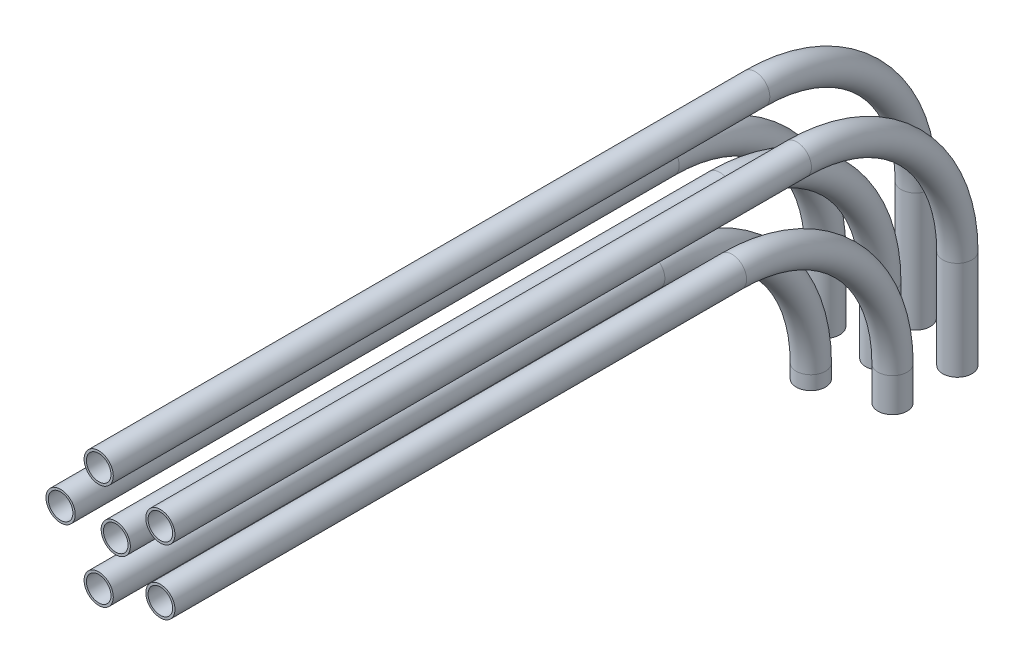
ISO-10303-21;
HEADER;
FILE_DESCRIPTION(('STEP AP214'),'2;1');
FILE_NAME('part.step','',(''),(''),'','','');
FILE_SCHEMA(('AUTOMOTIVE_DESIGN { 1 0 10303 214 1 1 1 1 }'));
ENDSEC;
DATA;
#1=APPLICATION_CONTEXT('core data for automotive mechanical design processes');
#2=APPLICATION_PROTOCOL_DEFINITION('international standard','automotive_design',2000,#1);
#3=PRODUCT_CONTEXT('',#1,'mechanical');
#4=PRODUCT('Part','Part','',(#3));
#5=PRODUCT_RELATED_PRODUCT_CATEGORY('part','',(#4));
#6=PRODUCT_DEFINITION_FORMATION('','',#4);
#7=PRODUCT_DEFINITION_CONTEXT('part definition',#1,'design');
#8=PRODUCT_DEFINITION('design','',#6,#7);
#9=PRODUCT_DEFINITION_SHAPE('','',#8);
#10=(LENGTH_UNIT() NAMED_UNIT(*) SI_UNIT(.MILLI.,.METRE.));
#11=(NAMED_UNIT(*) PLANE_ANGLE_UNIT() SI_UNIT($,.RADIAN.));
#12=(NAMED_UNIT(*) SI_UNIT($,.STERADIAN.) SOLID_ANGLE_UNIT());
#13=UNCERTAINTY_MEASURE_WITH_UNIT(LENGTH_MEASURE(1.E-05),#10,'distance_accuracy_value','');
#14=(GEOMETRIC_REPRESENTATION_CONTEXT(3) GLOBAL_UNCERTAINTY_ASSIGNED_CONTEXT((#13)) GLOBAL_UNIT_ASSIGNED_CONTEXT((#10,
#11,#12)) REPRESENTATION_CONTEXT('',''));
#15=CARTESIAN_POINT('',(0.,0.,0.));
#16=DIRECTION('',(0.,0.,1.));
#17=DIRECTION('',(1.,0.,0.));
#18=AXIS2_PLACEMENT_3D('',#15,#16,#17);
#19=CARTESIAN_POINT('',(-3.70820393249937,-11.4126781955418,120.));
#20=DIRECTION('',(0.,0.,1.));
#21=DIRECTION('',(1.,0.,0.));
#22=AXIS2_PLACEMENT_3D('',#19,#20,#21);
#23=PLANE('',#22);
#24=CARTESIAN_POINT('',(-3.70820393249937,-11.4126781955418,120.));
#25=DIRECTION('',(0.,0.,1.));
#26=DIRECTION('',(1.,0.,0.));
#27=AXIS2_PLACEMENT_3D('',#24,#25,#26);
#28=CIRCLE('',#27,3.175);
#29=CARTESIAN_POINT('',(-0.533203932499367,-11.4126781955418,120.));
#30=VERTEX_POINT('',#29);
#31=EDGE_CURVE('E12',#30,#30,#28,.T.);
#32=ORIENTED_EDGE('',*,*,#31,.T.);
#33=EDGE_LOOP('',(#32));
#34=FACE_BOUND('',#33,.T.);
#35=CARTESIAN_POINT('',(-3.70820393249937,-11.4126781955418,120.));
#36=DIRECTION('',(0.,0.,1.));
#37=DIRECTION('',(1.,0.,0.));
#38=AXIS2_PLACEMENT_3D('',#35,#36,#37);
#39=CIRCLE('',#38,2.675);
#40=CARTESIAN_POINT('',(-1.03320393249937,-11.4126781955418,120.));
#41=VERTEX_POINT('',#40);
#42=EDGE_CURVE('E82',#41,#41,#39,.T.);
#43=ORIENTED_EDGE('',*,*,#42,.F.);
#44=EDGE_LOOP('',(#43));
#45=FACE_BOUND('',#44,.T.);
#46=ADVANCED_FACE('F75',(#34,#45),#23,.T.);
#47=CARTESIAN_POINT('',(-3.70820393249937,-11.4126781955418,120.));
#48=DIRECTION('',(0.,0.,-1.));
#49=DIRECTION('',(-1.,0.,0.));
#50=AXIS2_PLACEMENT_3D('',#47,#48,#49);
#51=CYLINDRICAL_SURFACE('',#50,3.175);
#52=ORIENTED_EDGE('',*,*,#31,.F.);
#53=EDGE_LOOP('',(#52));
#54=FACE_BOUND('',#53,.T.);
#55=CARTESIAN_POINT('',(-3.70820393249937,-11.4126781955418,0.));
#56=DIRECTION('',(0.,0.,-1.));
#57=DIRECTION('',(-1.,0.,0.));
#58=AXIS2_PLACEMENT_3D('',#55,#56,#57);
#59=CIRCLE('',#58,3.175);
#60=CARTESIAN_POINT('',(-3.70820393249937,-8.23767819554184,0.));
#61=VERTEX_POINT('',#60);
#62=EDGE_CURVE('E95',#61,#61,#59,.T.);
#63=ORIENTED_EDGE('',*,*,#62,.F.);
#64=EDGE_LOOP('',(#63));
#65=FACE_BOUND('',#64,.T.);
#66=ADVANCED_FACE('F77',(#54,#65),#51,.T.);
#67=CARTESIAN_POINT('',(-3.70820393249937,-11.4126781955418,120.));
#68=DIRECTION('',(0.,0.,-1.));
#69=DIRECTION('',(-1.,0.,0.));
#70=AXIS2_PLACEMENT_3D('',#67,#68,#69);
#71=CYLINDRICAL_SURFACE('',#70,2.675);
#72=ORIENTED_EDGE('',*,*,#42,.T.);
#73=EDGE_LOOP('',(#72));
#74=FACE_BOUND('',#73,.T.);
#75=CARTESIAN_POINT('',(-3.70820393249937,-11.4126781955418,0.));
#76=DIRECTION('',(0.,0.,1.));
#77=DIRECTION('',(1.,0.,0.));
#78=AXIS2_PLACEMENT_3D('',#75,#76,#77);
#79=CIRCLE('',#78,2.675);
#80=CARTESIAN_POINT('',(-3.70820393249937,-8.73767819554184,0.));
#81=VERTEX_POINT('',#80);
#82=EDGE_CURVE('E86',#81,#81,#79,.T.);
#83=ORIENTED_EDGE('',*,*,#82,.F.);
#84=EDGE_LOOP('',(#83));
#85=FACE_BOUND('',#84,.T.);
#86=ADVANCED_FACE('F131',(#74,#85),#71,.F.);
#87=CARTESIAN_POINT('',(-3.70820393249937,-46.3376781955418,0.));
#88=DIRECTION('',(1.,0.,0.));
#89=DIRECTION('',(0.,0.,-1.));
#90=AXIS2_PLACEMENT_3D('',#87,#88,#89);
#91=TOROIDAL_SURFACE('',#90,34.925,2.675);
#92=CARTESIAN_POINT('',(-3.70820393249937,-46.337678195542,-34.925));
#93=DIRECTION('',(0.,-1.,0.));
#94=DIRECTION('',(0.,0.,-1.));
#95=AXIS2_PLACEMENT_3D('',#92,#93,#94);
#96=CIRCLE('',#95,2.675);
#97=CARTESIAN_POINT('',(-3.70820393249937,-46.337678195542,-37.6));
#98=VERTEX_POINT('',#97);
#99=EDGE_CURVE('E102',#98,#98,#96,.T.);
#100=CARTESIAN_POINT('',(-3.70820393249937,-46.3376781955418,0.));
#101=DIRECTION('',(1.,0.,0.));
#102=DIRECTION('',(0.,0.,-1.));
#103=AXIS2_PLACEMENT_3D('',#100,#101,#102);
#104=CIRCLE('',#103,37.6);
#105=EDGE_CURVE('',#98,#81,#104,.T.);
#106=ORIENTED_EDGE('',*,*,#99,.T.);
#107=ORIENTED_EDGE('',*,*,#82,.T.);
#108=ORIENTED_EDGE('',*,*,#105,.T.);
#109=ORIENTED_EDGE('',*,*,#105,.F.);
#110=EDGE_LOOP('',(#106,#108,#107,#109));
#111=FACE_BOUND('',#110,.T.);
#112=ADVANCED_FACE('F123',(#111),#91,.F.);
#113=CARTESIAN_POINT('',(-3.70820393249937,-46.3376781955418,0.));
#114=DIRECTION('',(1.,0.,0.));
#115=DIRECTION('',(0.,0.,-1.));
#116=AXIS2_PLACEMENT_3D('',#113,#114,#115);
#117=TOROIDAL_SURFACE('',#116,34.925,3.175);
#118=CARTESIAN_POINT('',(-3.70820393249937,-46.337678195542,-34.925));
#119=DIRECTION('',(0.,-1.,0.));
#120=DIRECTION('',(-1.,0.,0.));
#121=AXIS2_PLACEMENT_3D('',#118,#119,#120);
#122=CIRCLE('',#121,3.175);
#123=CARTESIAN_POINT('',(-3.70820393249937,-46.337678195542,-38.1));
#124=VERTEX_POINT('',#123);
#125=EDGE_CURVE('E91',#124,#124,#122,.T.);
#126=CARTESIAN_POINT('',(-3.70820393249937,-46.3376781955418,0.));
#127=DIRECTION('',(1.,0.,0.));
#128=DIRECTION('',(0.,0.,-1.));
#129=AXIS2_PLACEMENT_3D('',#126,#127,#128);
#130=CIRCLE('',#129,38.1);
#131=EDGE_CURVE('',#124,#61,#130,.T.);
#132=ORIENTED_EDGE('',*,*,#125,.F.);
#133=ORIENTED_EDGE('',*,*,#62,.T.);
#134=ORIENTED_EDGE('',*,*,#131,.T.);
#135=ORIENTED_EDGE('',*,*,#131,.F.);
#136=EDGE_LOOP('',(#132,#134,#133,#135));
#137=FACE_BOUND('',#136,.T.);
#138=ADVANCED_FACE('F114',(#137),#117,.T.);
#139=CARTESIAN_POINT('',(-3.70820393249937,-49.337678195542,-34.925));
#140=DIRECTION('',(0.,-1.,0.));
#141=DIRECTION('',(0.,0.,-1.));
#142=AXIS2_PLACEMENT_3D('',#139,#140,#141);
#143=PLANE('',#142);
#144=CARTESIAN_POINT('',(-3.70820393249937,-49.337678195542,-34.925));
#145=DIRECTION('',(0.,-1.,0.));
#146=DIRECTION('',(0.,0.,-1.));
#147=AXIS2_PLACEMENT_3D('',#144,#145,#146);
#148=CIRCLE('',#147,3.175);
#149=CARTESIAN_POINT('',(-3.70820393249937,-49.337678195542,-38.1));
#150=VERTEX_POINT('',#149);
#151=EDGE_CURVE('E98',#150,#150,#148,.T.);
#152=ORIENTED_EDGE('',*,*,#151,.T.);
#153=EDGE_LOOP('',(#152));
#154=FACE_BOUND('',#153,.T.);
#155=CARTESIAN_POINT('',(-3.70820393249937,-49.337678195542,-34.925));
#156=DIRECTION('',(0.,-1.,0.));
#157=DIRECTION('',(0.,0.,-1.));
#158=AXIS2_PLACEMENT_3D('',#155,#156,#157);
#159=CIRCLE('',#158,2.675);
#160=CARTESIAN_POINT('',(-3.70820393249937,-49.337678195542,-37.6));
#161=VERTEX_POINT('',#160);
#162=EDGE_CURVE('E101',#161,#161,#159,.T.);
#163=ORIENTED_EDGE('',*,*,#162,.F.);
#164=EDGE_LOOP('',(#163));
#165=FACE_BOUND('',#164,.T.);
#166=ADVANCED_FACE('F111',(#154,#165),#143,.T.);
#167=CARTESIAN_POINT('',(-3.70820393249937,-49.337678195542,-34.925));
#168=DIRECTION('',(0.,1.,0.));
#169=DIRECTION('',(0.,0.,1.));
#170=AXIS2_PLACEMENT_3D('',#167,#168,#169);
#171=CYLINDRICAL_SURFACE('',#170,3.175);
#172=ORIENTED_EDGE('',*,*,#151,.F.);
#173=EDGE_LOOP('',(#172));
#174=FACE_BOUND('',#173,.T.);
#175=ORIENTED_EDGE('',*,*,#125,.T.);
#176=EDGE_LOOP('',(#175));
#177=FACE_BOUND('',#176,.T.);
#178=ADVANCED_FACE('F113',(#174,#177),#171,.T.);
#179=CARTESIAN_POINT('',(-3.70820393249937,-49.337678195542,-34.925));
#180=DIRECTION('',(0.,1.,0.));
#181=DIRECTION('',(0.,0.,1.));
#182=AXIS2_PLACEMENT_3D('',#179,#180,#181);
#183=CYLINDRICAL_SURFACE('',#182,2.675);
#184=ORIENTED_EDGE('',*,*,#162,.T.);
#185=EDGE_LOOP('',(#184));
#186=FACE_BOUND('',#185,.T.);
#187=ORIENTED_EDGE('',*,*,#99,.F.);
#188=EDGE_LOOP('',(#187));
#189=FACE_BOUND('',#188,.T.);
#190=ADVANCED_FACE('F108',(#186,#189),#183,.F.);
#191=CLOSED_SHELL('',(#46,#66,#86,#112,#138,#166,#178,#190));
#192=MANIFOLD_SOLID_BREP('B2',#191);
#193=CARTESIAN_POINT('',(9.70820393249937,-7.05342302750968,120.));
#194=DIRECTION('',(0.,0.,1.));
#195=DIRECTION('',(1.,0.,0.));
#196=AXIS2_PLACEMENT_3D('',#193,#194,#195);
#197=PLANE('',#196);
#198=CARTESIAN_POINT('',(9.70820393249937,-7.05342302750968,120.));
#199=DIRECTION('',(0.,0.,1.));
#200=DIRECTION('',(1.,0.,0.));
#201=AXIS2_PLACEMENT_3D('',#198,#199,#200);
#202=CIRCLE('',#201,3.175);
#203=CARTESIAN_POINT('',(12.8832039324994,-7.05342302750968,120.));
#204=VERTEX_POINT('',#203);
#205=EDGE_CURVE('E74',#204,#204,#202,.T.);
#206=ORIENTED_EDGE('',*,*,#205,.T.);
#207=EDGE_LOOP('',(#206));
#208=FACE_BOUND('',#207,.T.);
#209=CARTESIAN_POINT('',(9.70820393249937,-7.05342302750968,120.));
#210=DIRECTION('',(0.,0.,1.));
#211=DIRECTION('',(1.,0.,0.));
#212=AXIS2_PLACEMENT_3D('',#209,#210,#211);
#213=CIRCLE('',#212,2.675);
#214=CARTESIAN_POINT('',(12.3832039324994,-7.05342302750968,120.));
#215=VERTEX_POINT('',#214);
#216=EDGE_CURVE('E211',#215,#215,#213,.T.);
#217=ORIENTED_EDGE('',*,*,#216,.F.);
#218=EDGE_LOOP('',(#217));
#219=FACE_BOUND('',#218,.T.);
#220=ADVANCED_FACE('F204',(#208,#219),#197,.T.);
#221=CARTESIAN_POINT('',(9.70820393249937,-7.05342302750968,120.));
#222=DIRECTION('',(0.,0.,-1.));
#223=DIRECTION('',(-1.,0.,0.));
#224=AXIS2_PLACEMENT_3D('',#221,#222,#223);
#225=CYLINDRICAL_SURFACE('',#224,3.175);
#226=ORIENTED_EDGE('',*,*,#205,.F.);
#227=EDGE_LOOP('',(#226));
#228=FACE_BOUND('',#227,.T.);
#229=CARTESIAN_POINT('',(9.70820393249937,-7.05342302750968,-4.35925517));
#230=DIRECTION('',(0.,0.,-1.));
#231=DIRECTION('',(-1.,0.,0.));
#232=AXIS2_PLACEMENT_3D('',#229,#230,#231);
#233=CIRCLE('',#232,3.175);
#234=CARTESIAN_POINT('',(9.70820393249937,-3.87842302750967,-4.35925517));
#235=VERTEX_POINT('',#234);
#236=EDGE_CURVE('E215',#235,#235,#233,.T.);
#237=ORIENTED_EDGE('',*,*,#236,.F.);
#238=EDGE_LOOP('',(#237));
#239=FACE_BOUND('',#238,.T.);
#240=ADVANCED_FACE('F206',(#228,#239),#225,.T.);
#241=CARTESIAN_POINT('',(9.70820393249937,-7.05342302750968,120.));
#242=DIRECTION('',(0.,0.,-1.));
#243=DIRECTION('',(-1.,0.,0.));
#244=AXIS2_PLACEMENT_3D('',#241,#242,#243);
#245=CYLINDRICAL_SURFACE('',#244,2.675);
#246=ORIENTED_EDGE('',*,*,#216,.T.);
#247=EDGE_LOOP('',(#246));
#248=FACE_BOUND('',#247,.T.);
#249=CARTESIAN_POINT('',(9.70820393249937,-7.05342302750968,-4.35925517));
#250=DIRECTION('',(0.,0.,-1.));
#251=DIRECTION('',(-1.,0.,0.));
#252=AXIS2_PLACEMENT_3D('',#249,#250,#251);
#253=CIRCLE('',#252,2.675);
#254=CARTESIAN_POINT('',(9.70820393249937,-4.37842302750967,-4.35925517));
#255=VERTEX_POINT('',#254);
#256=EDGE_CURVE('E224',#255,#255,#253,.T.);
#257=ORIENTED_EDGE('',*,*,#256,.T.);
#258=EDGE_LOOP('',(#257));
#259=FACE_BOUND('',#258,.T.);
#260=ADVANCED_FACE('F253',(#248,#259),#245,.F.);
#261=CARTESIAN_POINT('',(9.70820393249937,-41.9784230275097,-4.35925517));
#262=DIRECTION('',(1.,0.,0.));
#263=DIRECTION('',(0.,0.,-1.));
#264=AXIS2_PLACEMENT_3D('',#261,#262,#263);
#265=TOROIDAL_SURFACE('',#264,34.925,2.675);
#266=CARTESIAN_POINT('',(9.70820393249937,-41.9784230275098,-39.28425517));
#267=DIRECTION('',(0.,-1.,0.));
#268=DIRECTION('',(0.,0.,-1.));
#269=AXIS2_PLACEMENT_3D('',#266,#267,#268);
#270=CIRCLE('',#269,2.675);
#271=CARTESIAN_POINT('',(9.70820393249937,-41.9784230275098,-41.95925517));
#272=VERTEX_POINT('',#271);
#273=EDGE_CURVE('E227',#272,#272,#270,.T.);
#274=CARTESIAN_POINT('',(9.70820393249937,-41.9784230275097,-4.35925517));
#275=DIRECTION('',(1.,0.,0.));
#276=DIRECTION('',(0.,0.,-1.));
#277=AXIS2_PLACEMENT_3D('',#274,#275,#276);
#278=CIRCLE('',#277,37.6);
#279=EDGE_CURVE('',#272,#255,#278,.T.);
#280=ORIENTED_EDGE('',*,*,#273,.T.);
#281=ORIENTED_EDGE('',*,*,#256,.F.);
#282=ORIENTED_EDGE('',*,*,#279,.T.);
#283=ORIENTED_EDGE('',*,*,#279,.F.);
#284=EDGE_LOOP('',(#280,#282,#281,#283));
#285=FACE_BOUND('',#284,.T.);
#286=ADVANCED_FACE('F259',(#285),#265,.F.);
#287=CARTESIAN_POINT('',(9.70820393249937,-41.9784230275097,-4.35925517));
#288=DIRECTION('',(1.,0.,0.));
#289=DIRECTION('',(0.,0.,-1.));
#290=AXIS2_PLACEMENT_3D('',#287,#288,#289);
#291=TOROIDAL_SURFACE('',#290,34.925,3.175);
#292=CARTESIAN_POINT('',(9.70820393249937,-41.9784230275098,-39.28425517));
#293=DIRECTION('',(0.,-1.,0.));
#294=DIRECTION('',(-1.,0.,0.));
#295=AXIS2_PLACEMENT_3D('',#292,#293,#294);
#296=CIRCLE('',#295,3.175);
#297=CARTESIAN_POINT('',(9.70820393249937,-41.9784230275098,-42.45925517));
#298=VERTEX_POINT('',#297);
#299=EDGE_CURVE('E219',#298,#298,#296,.T.);
#300=CARTESIAN_POINT('',(9.70820393249937,-41.9784230275097,-4.35925517));
#301=DIRECTION('',(1.,0.,0.));
#302=DIRECTION('',(0.,0.,-1.));
#303=AXIS2_PLACEMENT_3D('',#300,#301,#302);
#304=CIRCLE('',#303,38.1);
#305=EDGE_CURVE('',#298,#235,#304,.T.);
#306=ORIENTED_EDGE('',*,*,#299,.F.);
#307=ORIENTED_EDGE('',*,*,#236,.T.);
#308=ORIENTED_EDGE('',*,*,#305,.T.);
#309=ORIENTED_EDGE('',*,*,#305,.F.);
#310=EDGE_LOOP('',(#306,#308,#307,#309));
#311=FACE_BOUND('',#310,.T.);
#312=ADVANCED_FACE('F260',(#311),#291,.T.);
#313=CARTESIAN_POINT('',(9.70820393249937,-55.3179343166111,-39.28425517));
#314=DIRECTION('',(0.,1.,0.));
#315=DIRECTION('',(0.,0.,1.));
#316=AXIS2_PLACEMENT_3D('',#313,#314,#315);
#317=CYLINDRICAL_SURFACE('',#316,3.175);
#318=ORIENTED_EDGE('',*,*,#299,.T.);
#319=EDGE_LOOP('',(#318));
#320=FACE_BOUND('',#319,.T.);
#321=CARTESIAN_POINT('',(9.70820393249937,-49.337678195542,-39.28425517));
#322=DIRECTION('',(0.,-1.,0.));
#323=DIRECTION('',(0.,0.,-1.));
#324=AXIS2_PLACEMENT_3D('',#321,#322,#323);
#325=CIRCLE('',#324,3.175);
#326=CARTESIAN_POINT('',(9.70820393249937,-49.337678195542,-42.45925517));
#327=VERTEX_POINT('',#326);
#328=EDGE_CURVE('E230',#327,#327,#325,.T.);
#329=ORIENTED_EDGE('',*,*,#328,.F.);
#330=EDGE_LOOP('',(#329));
#331=FACE_BOUND('',#330,.T.);
#332=ADVANCED_FACE('F246',(#320,#331),#317,.T.);
#333=CARTESIAN_POINT('',(9.70820393249937,-55.3179343166111,-39.28425517));
#334=DIRECTION('',(0.,1.,0.));
#335=DIRECTION('',(0.,0.,1.));
#336=AXIS2_PLACEMENT_3D('',#333,#334,#335);
#337=CYLINDRICAL_SURFACE('',#336,2.675);
#338=ORIENTED_EDGE('',*,*,#273,.F.);
#339=EDGE_LOOP('',(#338));
#340=FACE_BOUND('',#339,.T.);
#341=CARTESIAN_POINT('',(9.70820393249937,-49.337678195542,-39.28425517));
#342=DIRECTION('',(0.,-1.,0.));
#343=DIRECTION('',(0.,0.,-1.));
#344=AXIS2_PLACEMENT_3D('',#341,#342,#343);
#345=CIRCLE('',#344,2.67500000000001);
#346=CARTESIAN_POINT('',(9.70820393249937,-49.337678195542,-41.95925517));
#347=VERTEX_POINT('',#346);
#348=EDGE_CURVE('E233',#347,#347,#345,.T.);
#349=ORIENTED_EDGE('',*,*,#348,.T.);
#350=EDGE_LOOP('',(#349));
#351=FACE_BOUND('',#350,.T.);
#352=ADVANCED_FACE('F237',(#340,#351),#337,.F.);
#353=CARTESIAN_POINT('',(9.70820393249937,-49.337678195542,-39.28425517));
#354=DIRECTION('',(0.,-1.,0.));
#355=DIRECTION('',(0.,0.,-1.));
#356=AXIS2_PLACEMENT_3D('',#353,#354,#355);
#357=PLANE('',#356);
#358=ORIENTED_EDGE('',*,*,#328,.T.);
#359=EDGE_LOOP('',(#358));
#360=FACE_BOUND('',#359,.T.);
#361=ORIENTED_EDGE('',*,*,#348,.F.);
#362=EDGE_LOOP('',(#361));
#363=FACE_BOUND('',#362,.T.);
#364=ADVANCED_FACE('F239',(#360,#363),#357,.T.);
#365=CLOSED_SHELL('',(#220,#240,#260,#286,#312,#332,#352,#364));
#366=MANIFOLD_SOLID_BREP('B7',#365);
#367=CARTESIAN_POINT('',(9.70820393249937,7.05342302750968,120.));
#368=DIRECTION('',(0.,0.,1.));
#369=DIRECTION('',(1.,0.,0.));
#370=AXIS2_PLACEMENT_3D('',#367,#368,#369);
#371=PLANE('',#370);
#372=CARTESIAN_POINT('',(9.70820393249937,7.05342302750968,120.));
#373=DIRECTION('',(0.,0.,1.));
#374=DIRECTION('',(1.,0.,0.));
#375=AXIS2_PLACEMENT_3D('',#372,#373,#374);
#376=CIRCLE('',#375,3.175);
#377=CARTESIAN_POINT('',(12.8832039324994,7.05342302750968,120.));
#378=VERTEX_POINT('',#377);
#379=EDGE_CURVE('E203',#378,#378,#376,.T.);
#380=ORIENTED_EDGE('',*,*,#379,.T.);
#381=EDGE_LOOP('',(#380));
#382=FACE_BOUND('',#381,.T.);
#383=CARTESIAN_POINT('',(9.70820393249937,7.05342302750968,120.));
#384=DIRECTION('',(0.,0.,1.));
#385=DIRECTION('',(1.,0.,0.));
#386=AXIS2_PLACEMENT_3D('',#383,#384,#385);
#387=CIRCLE('',#386,2.675);
#388=CARTESIAN_POINT('',(12.3832039324994,7.05342302750968,120.));
#389=VERTEX_POINT('',#388);
#390=EDGE_CURVE('E352',#389,#389,#387,.T.);
#391=ORIENTED_EDGE('',*,*,#390,.F.);
#392=EDGE_LOOP('',(#391));
#393=FACE_BOUND('',#392,.T.);
#394=ADVANCED_FACE('F345',(#382,#393),#371,.T.);
#395=CARTESIAN_POINT('',(9.70820393249937,7.05342302750968,120.));
#396=DIRECTION('',(0.,0.,-1.));
#397=DIRECTION('',(-1.,0.,0.));
#398=AXIS2_PLACEMENT_3D('',#395,#396,#397);
#399=CYLINDRICAL_SURFACE('',#398,3.175);
#400=ORIENTED_EDGE('',*,*,#379,.F.);
#401=EDGE_LOOP('',(#400));
#402=FACE_BOUND('',#401,.T.);
#403=CARTESIAN_POINT('',(9.70820393249937,7.05342302750968,-18.46610122));
#404=DIRECTION('',(0.,0.,-1.));
#405=DIRECTION('',(-1.,0.,0.));
#406=AXIS2_PLACEMENT_3D('',#403,#404,#405);
#407=CIRCLE('',#406,3.175);
#408=CARTESIAN_POINT('',(9.70820393249937,10.2284230275097,-18.46610122));
#409=VERTEX_POINT('',#408);
#410=EDGE_CURVE('E356',#409,#409,#407,.T.);
#411=ORIENTED_EDGE('',*,*,#410,.F.);
#412=EDGE_LOOP('',(#411));
#413=FACE_BOUND('',#412,.T.);
#414=ADVANCED_FACE('F347',(#402,#413),#399,.T.);
#415=CARTESIAN_POINT('',(9.70820393249937,7.05342302750968,120.));
#416=DIRECTION('',(0.,0.,-1.));
#417=DIRECTION('',(-1.,0.,0.));
#418=AXIS2_PLACEMENT_3D('',#415,#416,#417);
#419=CYLINDRICAL_SURFACE('',#418,2.675);
#420=ORIENTED_EDGE('',*,*,#390,.T.);
#421=EDGE_LOOP('',(#420));
#422=FACE_BOUND('',#421,.T.);
#423=CARTESIAN_POINT('',(9.70820393249937,7.05342302750968,-18.46610122));
#424=DIRECTION('',(0.,0.,-1.));
#425=DIRECTION('',(-1.,0.,0.));
#426=AXIS2_PLACEMENT_3D('',#423,#424,#425);
#427=CIRCLE('',#426,2.675);
#428=CARTESIAN_POINT('',(9.70820393249937,9.72842302750969,-18.46610122));
#429=VERTEX_POINT('',#428);
#430=EDGE_CURVE('E365',#429,#429,#427,.T.);
#431=ORIENTED_EDGE('',*,*,#430,.T.);
#432=EDGE_LOOP('',(#431));
#433=FACE_BOUND('',#432,.T.);
#434=ADVANCED_FACE('F394',(#422,#433),#419,.F.);
#435=CARTESIAN_POINT('',(9.70820393249937,-27.8715769724903,-18.46610122));
#436=DIRECTION('',(1.,0.,0.));
#437=DIRECTION('',(0.,0.,-1.));
#438=AXIS2_PLACEMENT_3D('',#435,#436,#437);
#439=TOROIDAL_SURFACE('',#438,34.925,2.675);
#440=CARTESIAN_POINT('',(9.70820393249937,-27.8715769724905,-53.39110122));
#441=DIRECTION('',(0.,-1.,0.));
#442=DIRECTION('',(0.,0.,-1.));
#443=AXIS2_PLACEMENT_3D('',#440,#441,#442);
#444=CIRCLE('',#443,2.67500000000001);
#445=CARTESIAN_POINT('',(9.70820393249937,-27.8715769724905,-56.06610122));
#446=VERTEX_POINT('',#445);
#447=EDGE_CURVE('E368',#446,#446,#444,.T.);
#448=CARTESIAN_POINT('',(9.70820393249937,-27.8715769724903,-18.46610122));
#449=DIRECTION('',(1.,0.,0.));
#450=DIRECTION('',(0.,0.,-1.));
#451=AXIS2_PLACEMENT_3D('',#448,#449,#450);
#452=CIRCLE('',#451,37.6);
#453=EDGE_CURVE('',#446,#429,#452,.T.);
#454=ORIENTED_EDGE('',*,*,#447,.T.);
#455=ORIENTED_EDGE('',*,*,#430,.F.);
#456=ORIENTED_EDGE('',*,*,#453,.T.);
#457=ORIENTED_EDGE('',*,*,#453,.F.);
#458=EDGE_LOOP('',(#454,#456,#455,#457));
#459=FACE_BOUND('',#458,.T.);
#460=ADVANCED_FACE('F400',(#459),#439,.F.);
#461=CARTESIAN_POINT('',(9.70820393249937,-27.8715769724903,-18.46610122));
#462=DIRECTION('',(1.,0.,0.));
#463=DIRECTION('',(0.,0.,-1.));
#464=AXIS2_PLACEMENT_3D('',#461,#462,#463);
#465=TOROIDAL_SURFACE('',#464,34.925,3.175);
#466=CARTESIAN_POINT('',(9.70820393249937,-27.8715769724905,-53.39110122));
#467=DIRECTION('',(0.,-1.,0.));
#468=DIRECTION('',(-1.,0.,0.));
#469=AXIS2_PLACEMENT_3D('',#466,#467,#468);
#470=CIRCLE('',#469,3.175);
#471=CARTESIAN_POINT('',(9.70820393249937,-27.8715769724905,-56.56610122));
#472=VERTEX_POINT('',#471);
#473=EDGE_CURVE('E360',#472,#472,#470,.T.);
#474=CARTESIAN_POINT('',(9.70820393249937,-27.8715769724903,-18.46610122));
#475=DIRECTION('',(1.,0.,0.));
#476=DIRECTION('',(0.,0.,-1.));
#477=AXIS2_PLACEMENT_3D('',#474,#475,#476);
#478=CIRCLE('',#477,38.1);
#479=EDGE_CURVE('',#472,#409,#478,.T.);
#480=ORIENTED_EDGE('',*,*,#473,.F.);
#481=ORIENTED_EDGE('',*,*,#410,.T.);
#482=ORIENTED_EDGE('',*,*,#479,.T.);
#483=ORIENTED_EDGE('',*,*,#479,.F.);
#484=EDGE_LOOP('',(#480,#482,#481,#483));
#485=FACE_BOUND('',#484,.T.);
#486=ADVANCED_FACE('F401',(#485),#465,.T.);
#487=CARTESIAN_POINT('',(9.70820393249937,-55.3179343166112,-53.3911012199999));
#488=DIRECTION('',(0.,1.,0.));
#489=DIRECTION('',(0.,0.,1.));
#490=AXIS2_PLACEMENT_3D('',#487,#488,#489);
#491=CYLINDRICAL_SURFACE('',#490,3.175);
#492=ORIENTED_EDGE('',*,*,#473,.T.);
#493=EDGE_LOOP('',(#492));
#494=FACE_BOUND('',#493,.T.);
#495=CARTESIAN_POINT('',(9.70820393249937,-49.337678195542,-53.3911012199999));
#496=DIRECTION('',(0.,-1.,0.));
#497=DIRECTION('',(0.,0.,-1.));
#498=AXIS2_PLACEMENT_3D('',#495,#496,#497);
#499=CIRCLE('',#498,3.175);
#500=CARTESIAN_POINT('',(9.70820393249937,-49.337678195542,-56.5661012199999));
#501=VERTEX_POINT('',#500);
#502=EDGE_CURVE('E371',#501,#501,#499,.T.);
#503=ORIENTED_EDGE('',*,*,#502,.F.);
#504=EDGE_LOOP('',(#503));
#505=FACE_BOUND('',#504,.T.);
#506=ADVANCED_FACE('F387',(#494,#505),#491,.T.);
#507=CARTESIAN_POINT('',(9.70820393249937,-55.3179343166112,-53.3911012199999));
#508=DIRECTION('',(0.,1.,0.));
#509=DIRECTION('',(0.,0.,1.));
#510=AXIS2_PLACEMENT_3D('',#507,#508,#509);
#511=CYLINDRICAL_SURFACE('',#510,2.67500000000001);
#512=ORIENTED_EDGE('',*,*,#447,.F.);
#513=EDGE_LOOP('',(#512));
#514=FACE_BOUND('',#513,.T.);
#515=CARTESIAN_POINT('',(9.70820393249937,-49.337678195542,-53.3911012199999));
#516=DIRECTION('',(0.,-1.,0.));
#517=DIRECTION('',(0.,0.,-1.));
#518=AXIS2_PLACEMENT_3D('',#515,#516,#517);
#519=CIRCLE('',#518,2.67500000000001);
#520=CARTESIAN_POINT('',(9.70820393249937,-49.337678195542,-56.0661012199999));
#521=VERTEX_POINT('',#520);
#522=EDGE_CURVE('E374',#521,#521,#519,.T.);
#523=ORIENTED_EDGE('',*,*,#522,.T.);
#524=EDGE_LOOP('',(#523));
#525=FACE_BOUND('',#524,.T.);
#526=ADVANCED_FACE('F378',(#514,#525),#511,.F.);
#527=CARTESIAN_POINT('',(9.70820393249937,-49.337678195542,-53.3911012199999));
#528=DIRECTION('',(0.,-1.,0.));
#529=DIRECTION('',(0.,0.,-1.));
#530=AXIS2_PLACEMENT_3D('',#527,#528,#529);
#531=PLANE('',#530);
#532=ORIENTED_EDGE('',*,*,#502,.T.);
#533=EDGE_LOOP('',(#532));
#534=FACE_BOUND('',#533,.T.);
#535=ORIENTED_EDGE('',*,*,#522,.F.);
#536=EDGE_LOOP('',(#535));
#537=FACE_BOUND('',#536,.T.);
#538=ADVANCED_FACE('F380',(#534,#537),#531,.T.);
#539=CLOSED_SHELL('',(#394,#414,#434,#460,#486,#506,#526,#538));
#540=MANIFOLD_SOLID_BREP('B69',#539);
#541=CARTESIAN_POINT('',(-3.70820393249937,11.4126781955418,120.));
#542=DIRECTION('',(0.,0.,1.));
#543=DIRECTION('',(1.,0.,0.));
#544=AXIS2_PLACEMENT_3D('',#541,#542,#543);
#545=PLANE('',#544);
#546=CARTESIAN_POINT('',(-3.70820393249937,11.4126781955418,120.));
#547=DIRECTION('',(0.,0.,1.));
#548=DIRECTION('',(1.,0.,0.));
#549=AXIS2_PLACEMENT_3D('',#546,#547,#548);
#550=CIRCLE('',#549,3.175);
#551=CARTESIAN_POINT('',(-0.533203932499368,11.4126781955418,120.));
#552=VERTEX_POINT('',#551);
#553=EDGE_CURVE('E344',#552,#552,#550,.T.);
#554=ORIENTED_EDGE('',*,*,#553,.T.);
#555=EDGE_LOOP('',(#554));
#556=FACE_BOUND('',#555,.T.);
#557=CARTESIAN_POINT('',(-3.70820393249937,11.4126781955418,120.));
#558=DIRECTION('',(0.,0.,1.));
#559=DIRECTION('',(1.,0.,0.));
#560=AXIS2_PLACEMENT_3D('',#557,#558,#559);
#561=CIRCLE('',#560,2.675);
#562=CARTESIAN_POINT('',(-1.03320393249937,11.4126781955418,120.));
#563=VERTEX_POINT('',#562);
#564=EDGE_CURVE('E493',#563,#563,#561,.T.);
#565=ORIENTED_EDGE('',*,*,#564,.F.);
#566=EDGE_LOOP('',(#565));
#567=FACE_BOUND('',#566,.T.);
#568=ADVANCED_FACE('F486',(#556,#567),#545,.T.);
#569=CARTESIAN_POINT('',(-3.70820393249937,11.4126781955418,120.));
#570=DIRECTION('',(0.,0.,-1.));
#571=DIRECTION('',(-1.,0.,0.));
#572=AXIS2_PLACEMENT_3D('',#569,#570,#571);
#573=CYLINDRICAL_SURFACE('',#572,3.175);
#574=ORIENTED_EDGE('',*,*,#553,.F.);
#575=EDGE_LOOP('',(#574));
#576=FACE_BOUND('',#575,.T.);
#577=CARTESIAN_POINT('',(-3.70820393249937,11.4126781955418,-22.8253564));
#578=DIRECTION('',(0.,0.,-1.));
#579=DIRECTION('',(-1.,0.,0.));
#580=AXIS2_PLACEMENT_3D('',#577,#578,#579);
#581=CIRCLE('',#580,3.175);
#582=CARTESIAN_POINT('',(-3.70820393249937,14.5876781955419,-22.8253564));
#583=VERTEX_POINT('',#582);
#584=EDGE_CURVE('E497',#583,#583,#581,.T.);
#585=ORIENTED_EDGE('',*,*,#584,.F.);
#586=EDGE_LOOP('',(#585));
#587=FACE_BOUND('',#586,.T.);
#588=ADVANCED_FACE('F488',(#576,#587),#573,.T.);
#589=CARTESIAN_POINT('',(-3.70820393249937,11.4126781955418,120.));
#590=DIRECTION('',(0.,0.,-1.));
#591=DIRECTION('',(-1.,0.,0.));
#592=AXIS2_PLACEMENT_3D('',#589,#590,#591);
#593=CYLINDRICAL_SURFACE('',#592,2.675);
#594=ORIENTED_EDGE('',*,*,#564,.T.);
#595=EDGE_LOOP('',(#594));
#596=FACE_BOUND('',#595,.T.);
#597=CARTESIAN_POINT('',(-3.70820393249937,11.4126781955418,-22.8253564));
#598=DIRECTION('',(0.,0.,-1.));
#599=DIRECTION('',(-1.,0.,0.));
#600=AXIS2_PLACEMENT_3D('',#597,#598,#599);
#601=CIRCLE('',#600,2.675);
#602=CARTESIAN_POINT('',(-3.70820393249937,14.0876781955419,-22.8253564));
#603=VERTEX_POINT('',#602);
#604=EDGE_CURVE('E506',#603,#603,#601,.T.);
#605=ORIENTED_EDGE('',*,*,#604,.T.);
#606=EDGE_LOOP('',(#605));
#607=FACE_BOUND('',#606,.T.);
#608=ADVANCED_FACE('F535',(#596,#607),#593,.F.);
#609=CARTESIAN_POINT('',(-3.70820393249937,-23.5123218044582,-22.8253564));
#610=DIRECTION('',(1.,0.,0.));
#611=DIRECTION('',(0.,0.,-1.));
#612=AXIS2_PLACEMENT_3D('',#609,#610,#611);
#613=TOROIDAL_SURFACE('',#612,34.925,2.675);
#614=CARTESIAN_POINT('',(-3.70820393249937,-23.5123218044583,-57.7503564));
#615=DIRECTION('',(0.,-1.,0.));
#616=DIRECTION('',(0.,0.,-1.));
#617=AXIS2_PLACEMENT_3D('',#614,#615,#616);
#618=CIRCLE('',#617,2.675);
#619=CARTESIAN_POINT('',(-3.70820393249937,-23.5123218044583,-60.4253564));
#620=VERTEX_POINT('',#619);
#621=EDGE_CURVE('E509',#620,#620,#618,.T.);
#622=CARTESIAN_POINT('',(-3.70820393249937,-23.5123218044582,-22.8253564));
#623=DIRECTION('',(1.,0.,0.));
#624=DIRECTION('',(0.,0.,-1.));
#625=AXIS2_PLACEMENT_3D('',#622,#623,#624);
#626=CIRCLE('',#625,37.6);
#627=EDGE_CURVE('',#620,#603,#626,.T.);
#628=ORIENTED_EDGE('',*,*,#621,.T.);
#629=ORIENTED_EDGE('',*,*,#604,.F.);
#630=ORIENTED_EDGE('',*,*,#627,.T.);
#631=ORIENTED_EDGE('',*,*,#627,.F.);
#632=EDGE_LOOP('',(#628,#630,#629,#631));
#633=FACE_BOUND('',#632,.T.);
#634=ADVANCED_FACE('F541',(#633),#613,.F.);
#635=CARTESIAN_POINT('',(-3.70820393249937,-23.5123218044582,-22.8253564));
#636=DIRECTION('',(1.,0.,0.));
#637=DIRECTION('',(0.,0.,-1.));
#638=AXIS2_PLACEMENT_3D('',#635,#636,#637);
#639=TOROIDAL_SURFACE('',#638,34.925,3.175);
#640=CARTESIAN_POINT('',(-3.70820393249937,-23.5123218044583,-57.7503564));
#641=DIRECTION('',(0.,-1.,0.));
#642=DIRECTION('',(-1.,0.,0.));
#643=AXIS2_PLACEMENT_3D('',#640,#641,#642);
#644=CIRCLE('',#643,3.175);
#645=CARTESIAN_POINT('',(-3.70820393249937,-23.5123218044583,-60.9253564));
#646=VERTEX_POINT('',#645);
#647=EDGE_CURVE('E501',#646,#646,#644,.T.);
#648=CARTESIAN_POINT('',(-3.70820393249937,-23.5123218044582,-22.8253564));
#649=DIRECTION('',(1.,0.,0.));
#650=DIRECTION('',(0.,0.,-1.));
#651=AXIS2_PLACEMENT_3D('',#648,#649,#650);
#652=CIRCLE('',#651,38.1);
#653=EDGE_CURVE('',#646,#583,#652,.T.);
#654=ORIENTED_EDGE('',*,*,#647,.F.);
#655=ORIENTED_EDGE('',*,*,#584,.T.);
#656=ORIENTED_EDGE('',*,*,#653,.T.);
#657=ORIENTED_EDGE('',*,*,#653,.F.);
#658=EDGE_LOOP('',(#654,#656,#655,#657));
#659=FACE_BOUND('',#658,.T.);
#660=ADVANCED_FACE('F542',(#659),#639,.T.);
#661=CARTESIAN_POINT('',(-3.70820393249937,-55.3179343166112,-57.7503563999999));
#662=DIRECTION('',(0.,1.,0.));
#663=DIRECTION('',(0.,0.,1.));
#664=AXIS2_PLACEMENT_3D('',#661,#662,#663);
#665=CYLINDRICAL_SURFACE('',#664,3.175);
#666=ORIENTED_EDGE('',*,*,#647,.T.);
#667=EDGE_LOOP('',(#666));
#668=FACE_BOUND('',#667,.T.);
#669=CARTESIAN_POINT('',(-3.70820393249937,-49.337678195542,-57.7503563999999));
#670=DIRECTION('',(0.,-1.,0.));
#671=DIRECTION('',(0.,0.,-1.));
#672=AXIS2_PLACEMENT_3D('',#669,#670,#671);
#673=CIRCLE('',#672,3.175);
#674=CARTESIAN_POINT('',(-3.70820393249937,-49.3376781955421,-60.9253563999999));
#675=VERTEX_POINT('',#674);
#676=EDGE_CURVE('E512',#675,#675,#673,.T.);
#677=ORIENTED_EDGE('',*,*,#676,.F.);
#678=EDGE_LOOP('',(#677));
#679=FACE_BOUND('',#678,.T.);
#680=ADVANCED_FACE('F528',(#668,#679),#665,.T.);
#681=CARTESIAN_POINT('',(-3.70820393249937,-55.3179343166112,-57.7503563999999));
#682=DIRECTION('',(0.,1.,0.));
#683=DIRECTION('',(0.,0.,1.));
#684=AXIS2_PLACEMENT_3D('',#681,#682,#683);
#685=CYLINDRICAL_SURFACE('',#684,2.675);
#686=ORIENTED_EDGE('',*,*,#621,.F.);
#687=EDGE_LOOP('',(#686));
#688=FACE_BOUND('',#687,.T.);
#689=CARTESIAN_POINT('',(-3.70820393249937,-49.337678195542,-57.7503563999999));
#690=DIRECTION('',(0.,-1.,0.));
#691=DIRECTION('',(0.,0.,-1.));
#692=AXIS2_PLACEMENT_3D('',#689,#690,#691);
#693=CIRCLE('',#692,2.675);
#694=CARTESIAN_POINT('',(-3.70820393249937,-49.3376781955421,-60.4253563999999));
#695=VERTEX_POINT('',#694);
#696=EDGE_CURVE('E515',#695,#695,#693,.T.);
#697=ORIENTED_EDGE('',*,*,#696,.T.);
#698=EDGE_LOOP('',(#697));
#699=FACE_BOUND('',#698,.T.);
#700=ADVANCED_FACE('F519',(#688,#699),#685,.F.);
#701=CARTESIAN_POINT('',(-3.70820393249937,-49.337678195542,-57.7503563999999));
#702=DIRECTION('',(0.,-1.,0.));
#703=DIRECTION('',(0.,0.,-1.));
#704=AXIS2_PLACEMENT_3D('',#701,#702,#703);
#705=PLANE('',#704);
#706=ORIENTED_EDGE('',*,*,#676,.T.);
#707=EDGE_LOOP('',(#706));
#708=FACE_BOUND('',#707,.T.);
#709=ORIENTED_EDGE('',*,*,#696,.F.);
#710=EDGE_LOOP('',(#709));
#711=FACE_BOUND('',#710,.T.);
#712=ADVANCED_FACE('F521',(#708,#711),#705,.T.);
#713=CLOSED_SHELL('',(#568,#588,#608,#634,#660,#680,#700,#712));
#714=MANIFOLD_SOLID_BREP('B198',#713);
#715=CARTESIAN_POINT('',(-12.,0.,120.));
#716=DIRECTION('',(0.,0.,1.));
#717=DIRECTION('',(1.,0.,0.));
#718=AXIS2_PLACEMENT_3D('',#715,#716,#717);
#719=PLANE('',#718);
#720=CARTESIAN_POINT('',(-12.,0.,120.));
#721=DIRECTION('',(0.,0.,1.));
#722=DIRECTION('',(1.,0.,0.));
#723=AXIS2_PLACEMENT_3D('',#720,#721,#722);
#724=CIRCLE('',#723,3.175);
#725=CARTESIAN_POINT('',(-8.825,0.,120.));
#726=VERTEX_POINT('',#725);
#727=EDGE_CURVE('E485',#726,#726,#724,.T.);
#728=ORIENTED_EDGE('',*,*,#727,.T.);
#729=EDGE_LOOP('',(#728));
#730=FACE_BOUND('',#729,.T.);
#731=CARTESIAN_POINT('',(-12.,0.,120.));
#732=DIRECTION('',(0.,0.,1.));
#733=DIRECTION('',(1.,0.,0.));
#734=AXIS2_PLACEMENT_3D('',#731,#732,#733);
#735=CIRCLE('',#734,2.675);
#736=CARTESIAN_POINT('',(-9.325,0.,120.));
#737=VERTEX_POINT('',#736);
#738=EDGE_CURVE('E633',#737,#737,#735,.T.);
#739=ORIENTED_EDGE('',*,*,#738,.F.);
#740=EDGE_LOOP('',(#739));
#741=FACE_BOUND('',#740,.T.);
#742=ADVANCED_FACE('F626',(#730,#741),#719,.T.);
#743=CARTESIAN_POINT('',(-12.,0.,120.));
#744=DIRECTION('',(0.,0.,-1.));
#745=DIRECTION('',(-1.,0.,0.));
#746=AXIS2_PLACEMENT_3D('',#743,#744,#745);
#747=CYLINDRICAL_SURFACE('',#746,3.175);
#748=ORIENTED_EDGE('',*,*,#727,.F.);
#749=EDGE_LOOP('',(#748));
#750=FACE_BOUND('',#749,.T.);
#751=CARTESIAN_POINT('',(-12.,0.,-11.4126782));
#752=DIRECTION('',(0.,0.,-1.));
#753=DIRECTION('',(-1.,0.,0.));
#754=AXIS2_PLACEMENT_3D('',#751,#752,#753);
#755=CIRCLE('',#754,3.175);
#756=CARTESIAN_POINT('',(-12.,3.175,-11.4126782));
#757=VERTEX_POINT('',#756);
#758=EDGE_CURVE('E637',#757,#757,#755,.T.);
#759=ORIENTED_EDGE('',*,*,#758,.F.);
#760=EDGE_LOOP('',(#759));
#761=FACE_BOUND('',#760,.T.);
#762=ADVANCED_FACE('F628',(#750,#761),#747,.T.);
#763=CARTESIAN_POINT('',(-12.,0.,120.));
#764=DIRECTION('',(0.,0.,-1.));
#765=DIRECTION('',(-1.,0.,0.));
#766=AXIS2_PLACEMENT_3D('',#763,#764,#765);
#767=CYLINDRICAL_SURFACE('',#766,2.675);
#768=ORIENTED_EDGE('',*,*,#738,.T.);
#769=EDGE_LOOP('',(#768));
#770=FACE_BOUND('',#769,.T.);
#771=CARTESIAN_POINT('',(-12.,0.,-11.4126782));
#772=DIRECTION('',(0.,0.,-1.));
#773=DIRECTION('',(-1.,0.,0.));
#774=AXIS2_PLACEMENT_3D('',#771,#772,#773);
#775=CIRCLE('',#774,2.675);
#776=CARTESIAN_POINT('',(-12.,2.675,-11.4126782));
#777=VERTEX_POINT('',#776);
#778=EDGE_CURVE('E646',#777,#777,#775,.T.);
#779=ORIENTED_EDGE('',*,*,#778,.T.);
#780=EDGE_LOOP('',(#779));
#781=FACE_BOUND('',#780,.T.);
#782=ADVANCED_FACE('F675',(#770,#781),#767,.F.);
#783=CARTESIAN_POINT('',(-12.,-34.925,-11.4126782));
#784=DIRECTION('',(1.,0.,0.));
#785=DIRECTION('',(0.,1.,0.));
#786=AXIS2_PLACEMENT_3D('',#783,#784,#785);
#787=TOROIDAL_SURFACE('',#786,34.925,2.675);
#788=CARTESIAN_POINT('',(-12.,-34.9250000000001,-46.3376782));
#789=DIRECTION('',(0.,-1.,0.));
#790=DIRECTION('',(0.,0.,-1.));
#791=AXIS2_PLACEMENT_3D('',#788,#789,#790);
#792=CIRCLE('',#791,2.675);
#793=CARTESIAN_POINT('',(-12.,-34.9250000000001,-49.0126782));
#794=VERTEX_POINT('',#793);
#795=EDGE_CURVE('E649',#794,#794,#792,.T.);
#796=CARTESIAN_POINT('',(-12.,-34.925,-11.4126782));
#797=DIRECTION('',(1.,0.,0.));
#798=DIRECTION('',(0.,1.,0.));
#799=AXIS2_PLACEMENT_3D('',#796,#797,#798);
#800=CIRCLE('',#799,37.6);
#801=EDGE_CURVE('',#794,#777,#800,.T.);
#802=ORIENTED_EDGE('',*,*,#795,.T.);
#803=ORIENTED_EDGE('',*,*,#778,.F.);
#804=ORIENTED_EDGE('',*,*,#801,.T.);
#805=ORIENTED_EDGE('',*,*,#801,.F.);
#806=EDGE_LOOP('',(#802,#804,#803,#805));
#807=FACE_BOUND('',#806,.T.);
#808=ADVANCED_FACE('F681',(#807),#787,.F.);
#809=CARTESIAN_POINT('',(-12.,-34.925,-11.4126782));
#810=DIRECTION('',(1.,0.,0.));
#811=DIRECTION('',(0.,1.,0.));
#812=AXIS2_PLACEMENT_3D('',#809,#810,#811);
#813=TOROIDAL_SURFACE('',#812,34.925,3.175);
#814=CARTESIAN_POINT('',(-12.,-34.9250000000001,-46.3376782));
#815=DIRECTION('',(0.,-1.,0.));
#816=DIRECTION('',(-1.,0.,0.));
#817=AXIS2_PLACEMENT_3D('',#814,#815,#816);
#818=CIRCLE('',#817,3.175);
#819=CARTESIAN_POINT('',(-12.,-34.9250000000001,-49.5126782));
#820=VERTEX_POINT('',#819);
#821=EDGE_CURVE('E641',#820,#820,#818,.T.);
#822=CARTESIAN_POINT('',(-12.,-34.925,-11.4126782));
#823=DIRECTION('',(1.,0.,0.));
#824=DIRECTION('',(0.,1.,0.));
#825=AXIS2_PLACEMENT_3D('',#822,#823,#824);
#826=CIRCLE('',#825,38.1);
#827=EDGE_CURVE('',#820,#757,#826,.T.);
#828=ORIENTED_EDGE('',*,*,#821,.F.);
#829=ORIENTED_EDGE('',*,*,#758,.T.);
#830=ORIENTED_EDGE('',*,*,#827,.T.);
#831=ORIENTED_EDGE('',*,*,#827,.F.);
#832=EDGE_LOOP('',(#828,#830,#829,#831));
#833=FACE_BOUND('',#832,.T.);
#834=ADVANCED_FACE('F682',(#833),#813,.T.);
#835=CARTESIAN_POINT('',(-12.,-55.3179343166111,-46.3376781999999));
#836=DIRECTION('',(0.,1.,0.));
#837=DIRECTION('',(0.,0.,1.));
#838=AXIS2_PLACEMENT_3D('',#835,#836,#837);
#839=CYLINDRICAL_SURFACE('',#838,3.175);
#840=ORIENTED_EDGE('',*,*,#821,.T.);
#841=EDGE_LOOP('',(#840));
#842=FACE_BOUND('',#841,.T.);
#843=CARTESIAN_POINT('',(-12.,-49.337678195542,-46.3376781999999));
#844=DIRECTION('',(0.,-1.,0.));
#845=DIRECTION('',(0.,0.,-1.));
#846=AXIS2_PLACEMENT_3D('',#843,#844,#845);
#847=CIRCLE('',#846,3.175);
#848=CARTESIAN_POINT('',(-12.,-49.337678195542,-49.5126781999999));
#849=VERTEX_POINT('',#848);
#850=EDGE_CURVE('E652',#849,#849,#847,.T.);
#851=ORIENTED_EDGE('',*,*,#850,.F.);
#852=EDGE_LOOP('',(#851));
#853=FACE_BOUND('',#852,.T.);
#854=ADVANCED_FACE('F668',(#842,#853),#839,.T.);
#855=CARTESIAN_POINT('',(-12.,-55.3179343166111,-46.3376781999999));
#856=DIRECTION('',(0.,1.,0.));
#857=DIRECTION('',(0.,0.,1.));
#858=AXIS2_PLACEMENT_3D('',#855,#856,#857);
#859=CYLINDRICAL_SURFACE('',#858,2.675);
#860=ORIENTED_EDGE('',*,*,#795,.F.);
#861=EDGE_LOOP('',(#860));
#862=FACE_BOUND('',#861,.T.);
#863=CARTESIAN_POINT('',(-12.,-49.337678195542,-46.3376781999999));
#864=DIRECTION('',(0.,-1.,0.));
#865=DIRECTION('',(0.,0.,-1.));
#866=AXIS2_PLACEMENT_3D('',#863,#864,#865);
#867=CIRCLE('',#866,2.67500000000001);
#868=CARTESIAN_POINT('',(-12.,-49.337678195542,-49.0126782));
#869=VERTEX_POINT('',#868);
#870=EDGE_CURVE('E655',#869,#869,#867,.T.);
#871=ORIENTED_EDGE('',*,*,#870,.T.);
#872=EDGE_LOOP('',(#871));
#873=FACE_BOUND('',#872,.T.);
#874=ADVANCED_FACE('F659',(#862,#873),#859,.F.);
#875=CARTESIAN_POINT('',(-12.,-49.337678195542,-46.3376781999999));
#876=DIRECTION('',(0.,-1.,0.));
#877=DIRECTION('',(0.,0.,-1.));
#878=AXIS2_PLACEMENT_3D('',#875,#876,#877);
#879=PLANE('',#878);
#880=ORIENTED_EDGE('',*,*,#850,.T.);
#881=EDGE_LOOP('',(#880));
#882=FACE_BOUND('',#881,.T.);
#883=ORIENTED_EDGE('',*,*,#870,.F.);
#884=EDGE_LOOP('',(#883));
#885=FACE_BOUND('',#884,.T.);
#886=ADVANCED_FACE('F661',(#882,#885),#879,.T.);
#887=CLOSED_SHELL('',(#742,#762,#782,#808,#834,#854,#874,#886));
#888=MANIFOLD_SOLID_BREP('B339',#887);
#889=CARTESIAN_POINT('',(0.,0.,120.));
#890=DIRECTION('',(0.,0.,1.));
#891=DIRECTION('',(1.,0.,0.));
#892=AXIS2_PLACEMENT_3D('',#889,#890,#891);
#893=PLANE('',#892);
#894=CARTESIAN_POINT('',(0.,0.,120.));
#895=DIRECTION('',(0.,0.,1.));
#896=DIRECTION('',(1.,0.,0.));
#897=AXIS2_PLACEMENT_3D('',#894,#895,#896);
#898=CIRCLE('',#897,3.175);
#899=CARTESIAN_POINT('',(3.175,0.,120.));
#900=VERTEX_POINT('',#899);
#901=EDGE_CURVE('E625',#900,#900,#898,.T.);
#902=ORIENTED_EDGE('',*,*,#901,.T.);
#903=EDGE_LOOP('',(#902));
#904=FACE_BOUND('',#903,.T.);
#905=CARTESIAN_POINT('',(0.,0.,120.));
#906=DIRECTION('',(0.,0.,1.));
#907=DIRECTION('',(1.,0.,0.));
#908=AXIS2_PLACEMENT_3D('',#905,#906,#907);
#909=CIRCLE('',#908,2.675);
#910=CARTESIAN_POINT('',(2.675,0.,120.));
#911=VERTEX_POINT('',#910);
#912=EDGE_CURVE('E766',#911,#911,#909,.T.);
#913=ORIENTED_EDGE('',*,*,#912,.F.);
#914=EDGE_LOOP('',(#913));
#915=FACE_BOUND('',#914,.T.);
#916=ADVANCED_FACE('F759',(#904,#915),#893,.T.);
#917=CARTESIAN_POINT('',(0.,0.,120.));
#918=DIRECTION('',(0.,0.,-1.));
#919=DIRECTION('',(-1.,0.,0.));
#920=AXIS2_PLACEMENT_3D('',#917,#918,#919);
#921=CYLINDRICAL_SURFACE('',#920,3.175);
#922=ORIENTED_EDGE('',*,*,#901,.F.);
#923=EDGE_LOOP('',(#922));
#924=FACE_BOUND('',#923,.T.);
#925=CARTESIAN_POINT('',(0.,0.,-11.4126782));
#926=DIRECTION('',(0.,0.,-1.));
#927=DIRECTION('',(-1.,0.,0.));
#928=AXIS2_PLACEMENT_3D('',#925,#926,#927);
#929=CIRCLE('',#928,3.175);
#930=CARTESIAN_POINT('',(0.,3.175,-11.4126782));
#931=VERTEX_POINT('',#930);
#932=EDGE_CURVE('E770',#931,#931,#929,.T.);
#933=ORIENTED_EDGE('',*,*,#932,.F.);
#934=EDGE_LOOP('',(#933));
#935=FACE_BOUND('',#934,.T.);
#936=ADVANCED_FACE('F761',(#924,#935),#921,.T.);
#937=CARTESIAN_POINT('',(0.,0.,120.));
#938=DIRECTION('',(0.,0.,-1.));
#939=DIRECTION('',(-1.,0.,0.));
#940=AXIS2_PLACEMENT_3D('',#937,#938,#939);
#941=CYLINDRICAL_SURFACE('',#940,2.675);
#942=ORIENTED_EDGE('',*,*,#912,.T.);
#943=EDGE_LOOP('',(#942));
#944=FACE_BOUND('',#943,.T.);
#945=CARTESIAN_POINT('',(0.,0.,-11.4126782));
#946=DIRECTION('',(0.,0.,-1.));
#947=DIRECTION('',(-1.,0.,0.));
#948=AXIS2_PLACEMENT_3D('',#945,#946,#947);
#949=CIRCLE('',#948,2.675);
#950=CARTESIAN_POINT('',(0.,2.675,-11.4126782));
#951=VERTEX_POINT('',#950);
#952=EDGE_CURVE('E779',#951,#951,#949,.T.);
#953=ORIENTED_EDGE('',*,*,#952,.T.);
#954=EDGE_LOOP('',(#953));
#955=FACE_BOUND('',#954,.T.);
#956=ADVANCED_FACE('F808',(#944,#955),#941,.F.);
#957=CARTESIAN_POINT('',(0.,-34.925,-11.4126782));
#958=DIRECTION('',(1.,0.,0.));
#959=DIRECTION('',(0.,1.,0.));
#960=AXIS2_PLACEMENT_3D('',#957,#958,#959);
#961=TOROIDAL_SURFACE('',#960,34.925,2.675);
#962=CARTESIAN_POINT('',(0.,-34.9250000000001,-46.3376782));
#963=DIRECTION('',(0.,-1.,0.));
#964=DIRECTION('',(0.,0.,-1.));
#965=AXIS2_PLACEMENT_3D('',#962,#963,#964);
#966=CIRCLE('',#965,2.675);
#967=CARTESIAN_POINT('',(0.,-34.9250000000001,-49.0126782));
#968=VERTEX_POINT('',#967);
#969=EDGE_CURVE('E782',#968,#968,#966,.T.);
#970=CARTESIAN_POINT('',(0.,-34.925,-11.4126782));
#971=DIRECTION('',(1.,0.,0.));
#972=DIRECTION('',(0.,1.,0.));
#973=AXIS2_PLACEMENT_3D('',#970,#971,#972);
#974=CIRCLE('',#973,37.6);
#975=EDGE_CURVE('',#968,#951,#974,.T.);
#976=ORIENTED_EDGE('',*,*,#969,.T.);
#977=ORIENTED_EDGE('',*,*,#952,.F.);
#978=ORIENTED_EDGE('',*,*,#975,.T.);
#979=ORIENTED_EDGE('',*,*,#975,.F.);
#980=EDGE_LOOP('',(#976,#978,#977,#979));
#981=FACE_BOUND('',#980,.T.);
#982=ADVANCED_FACE('F814',(#981),#961,.F.);
#983=CARTESIAN_POINT('',(0.,-34.925,-11.4126782));
#984=DIRECTION('',(1.,0.,0.));
#985=DIRECTION('',(0.,1.,0.));
#986=AXIS2_PLACEMENT_3D('',#983,#984,#985);
#987=TOROIDAL_SURFACE('',#986,34.925,3.175);
#988=CARTESIAN_POINT('',(0.,-34.9250000000001,-46.3376782));
#989=DIRECTION('',(0.,-1.,0.));
#990=DIRECTION('',(-1.,0.,0.));
#991=AXIS2_PLACEMENT_3D('',#988,#989,#990);
#992=CIRCLE('',#991,3.175);
#993=CARTESIAN_POINT('',(0.,-34.9250000000001,-49.5126782));
#994=VERTEX_POINT('',#993);
#995=EDGE_CURVE('E774',#994,#994,#992,.T.);
#996=CARTESIAN_POINT('',(0.,-34.925,-11.4126782));
#997=DIRECTION('',(1.,0.,0.));
#998=DIRECTION('',(0.,1.,0.));
#999=AXIS2_PLACEMENT_3D('',#996,#997,#998);
#1000=CIRCLE('',#999,38.1);
#1001=EDGE_CURVE('',#994,#931,#1000,.T.);
#1002=ORIENTED_EDGE('',*,*,#995,.F.);
#1003=ORIENTED_EDGE('',*,*,#932,.T.);
#1004=ORIENTED_EDGE('',*,*,#1001,.T.);
#1005=ORIENTED_EDGE('',*,*,#1001,.F.);
#1006=EDGE_LOOP('',(#1002,#1004,#1003,#1005));
#1007=FACE_BOUND('',#1006,.T.);
#1008=ADVANCED_FACE('F815',(#1007),#987,.T.);
#1009=CARTESIAN_POINT('',(0.,-55.3179343166111,-46.3376781999999));
#1010=DIRECTION('',(0.,1.,0.));
#1011=DIRECTION('',(0.,0.,1.));
#1012=AXIS2_PLACEMENT_3D('',#1009,#1010,#1011);
#1013=CYLINDRICAL_SURFACE('',#1012,3.175);
#1014=ORIENTED_EDGE('',*,*,#995,.T.);
#1015=EDGE_LOOP('',(#1014));
#1016=FACE_BOUND('',#1015,.T.);
#1017=CARTESIAN_POINT('',(0.,-49.337678195542,-46.3376781999999));
#1018=DIRECTION('',(0.,-1.,0.));
#1019=DIRECTION('',(0.,0.,-1.));
#1020=AXIS2_PLACEMENT_3D('',#1017,#1018,#1019);
#1021=CIRCLE('',#1020,3.175);
#1022=CARTESIAN_POINT('',(0.,-49.337678195542,-49.5126781999999));
#1023=VERTEX_POINT('',#1022);
#1024=EDGE_CURVE('E785',#1023,#1023,#1021,.T.);
#1025=ORIENTED_EDGE('',*,*,#1024,.F.);
#1026=EDGE_LOOP('',(#1025));
#1027=FACE_BOUND('',#1026,.T.);
#1028=ADVANCED_FACE('F801',(#1016,#1027),#1013,.T.);
#1029=CARTESIAN_POINT('',(0.,-55.3179343166111,-46.3376781999999));
#1030=DIRECTION('',(0.,1.,0.));
#1031=DIRECTION('',(0.,0.,1.));
#1032=AXIS2_PLACEMENT_3D('',#1029,#1030,#1031);
#1033=CYLINDRICAL_SURFACE('',#1032,2.675);
#1034=ORIENTED_EDGE('',*,*,#969,.F.);
#1035=EDGE_LOOP('',(#1034));
#1036=FACE_BOUND('',#1035,.T.);
#1037=CARTESIAN_POINT('',(0.,-49.337678195542,-46.3376781999999));
#1038=DIRECTION('',(0.,-1.,0.));
#1039=DIRECTION('',(0.,0.,-1.));
#1040=AXIS2_PLACEMENT_3D('',#1037,#1038,#1039);
#1041=CIRCLE('',#1040,2.675);
#1042=CARTESIAN_POINT('',(0.,-49.337678195542,-49.0126781999999));
#1043=VERTEX_POINT('',#1042);
#1044=EDGE_CURVE('E788',#1043,#1043,#1041,.T.);
#1045=ORIENTED_EDGE('',*,*,#1044,.T.);
#1046=EDGE_LOOP('',(#1045));
#1047=FACE_BOUND('',#1046,.T.);
#1048=ADVANCED_FACE('F792',(#1036,#1047),#1033,.F.);
#1049=CARTESIAN_POINT('',(0.,-49.337678195542,-46.3376781999999));
#1050=DIRECTION('',(0.,-1.,0.));
#1051=DIRECTION('',(0.,0.,-1.));
#1052=AXIS2_PLACEMENT_3D('',#1049,#1050,#1051);
#1053=PLANE('',#1052);
#1054=ORIENTED_EDGE('',*,*,#1024,.T.);
#1055=EDGE_LOOP('',(#1054));
#1056=FACE_BOUND('',#1055,.T.);
#1057=ORIENTED_EDGE('',*,*,#1044,.F.);
#1058=EDGE_LOOP('',(#1057));
#1059=FACE_BOUND('',#1058,.T.);
#1060=ADVANCED_FACE('F794',(#1056,#1059),#1053,.T.);
#1061=CLOSED_SHELL('',(#916,#936,#956,#982,#1008,#1028,#1048,#1060));
#1062=MANIFOLD_SOLID_BREP('B480',#1061);
#1063=ADVANCED_BREP_SHAPE_REPRESENTATION('',(#18,#192,#366,#540,#714,#888,#1062),#14);
#1064=SHAPE_DEFINITION_REPRESENTATION(#9,#1063);
ENDSEC;
END-ISO-10303-21;
